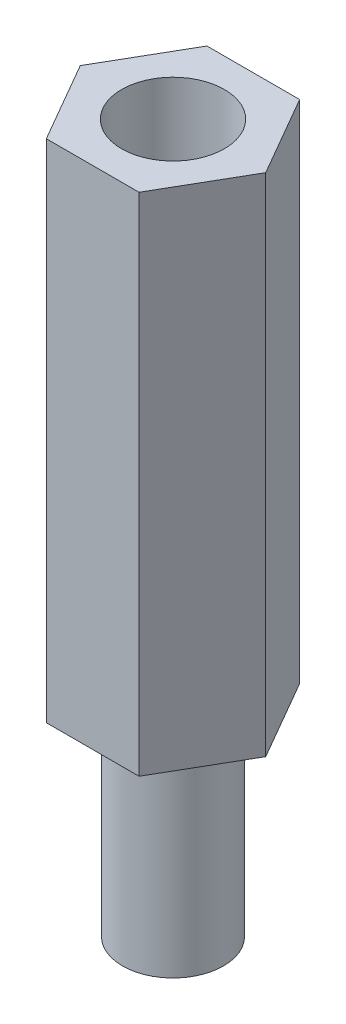
ISO-10303-21;
HEADER;
FILE_DESCRIPTION(('STEP AP214'),'2;1');
FILE_NAME('part.step','',(''),(''),'','','');
FILE_SCHEMA(('AUTOMOTIVE_DESIGN { 1 0 10303 214 1 1 1 1 }'));
ENDSEC;
DATA;
#1=APPLICATION_CONTEXT('core data for automotive mechanical design processes');
#2=APPLICATION_PROTOCOL_DEFINITION('international standard','automotive_design',2000,#1);
#3=PRODUCT_CONTEXT('',#1,'mechanical');
#4=PRODUCT('Part','Part','',(#3));
#5=PRODUCT_RELATED_PRODUCT_CATEGORY('part','',(#4));
#6=PRODUCT_DEFINITION_FORMATION('','',#4);
#7=PRODUCT_DEFINITION_CONTEXT('part definition',#1,'design');
#8=PRODUCT_DEFINITION('design','',#6,#7);
#9=PRODUCT_DEFINITION_SHAPE('','',#8);
#10=(LENGTH_UNIT() NAMED_UNIT(*) SI_UNIT(.MILLI.,.METRE.));
#11=(NAMED_UNIT(*) PLANE_ANGLE_UNIT() SI_UNIT($,.RADIAN.));
#12=(NAMED_UNIT(*) SI_UNIT($,.STERADIAN.) SOLID_ANGLE_UNIT());
#13=UNCERTAINTY_MEASURE_WITH_UNIT(LENGTH_MEASURE(1.E-05),#10,'distance_accuracy_value','');
#14=(GEOMETRIC_REPRESENTATION_CONTEXT(3) GLOBAL_UNCERTAINTY_ASSIGNED_CONTEXT((#13)) GLOBAL_UNIT_ASSIGNED_CONTEXT((#10,
#11,#12)) REPRESENTATION_CONTEXT('',''));
#15=CARTESIAN_POINT('',(0.,0.,0.));
#16=DIRECTION('',(0.,0.,1.));
#17=DIRECTION('',(1.,0.,0.));
#18=AXIS2_PLACEMENT_3D('',#15,#16,#17);
#19=CARTESIAN_POINT('',(0.,6.,0.));
#20=DIRECTION('',(0.,-1.,0.));
#21=DIRECTION('',(0.,0.,-1.));
#22=AXIS2_PLACEMENT_3D('',#19,#20,#21);
#23=CYLINDRICAL_SURFACE('',#22,1.5);
#24=CARTESIAN_POINT('',(0.,6.,0.));
#25=DIRECTION('',(0.,1.,0.));
#26=DIRECTION('',(0.,0.,1.));
#27=AXIS2_PLACEMENT_3D('',#24,#25,#26);
#28=CIRCLE('',#27,1.5);
#29=CARTESIAN_POINT('',(0.,6.,1.5));
#30=VERTEX_POINT('',#29);
#31=EDGE_CURVE('E11',#30,#30,#28,.T.);
#32=ORIENTED_EDGE('',*,*,#31,.F.);
#33=EDGE_LOOP('',(#32));
#34=FACE_BOUND('',#33,.T.);
#35=CARTESIAN_POINT('',(0.,0.,0.));
#36=DIRECTION('',(0.,1.,0.));
#37=DIRECTION('',(0.,0.,1.));
#38=AXIS2_PLACEMENT_3D('',#35,#36,#37);
#39=CIRCLE('',#38,1.5);
#40=CARTESIAN_POINT('',(0.,0.,1.5));
#41=VERTEX_POINT('',#40);
#42=EDGE_CURVE('E42',#41,#41,#39,.T.);
#43=ORIENTED_EDGE('',*,*,#42,.T.);
#44=EDGE_LOOP('',(#43));
#45=FACE_BOUND('',#44,.T.);
#46=ADVANCED_FACE('F39',(#34,#45),#23,.T.);
#47=CARTESIAN_POINT('',(0.,0.,0.));
#48=DIRECTION('',(0.,1.,0.));
#49=DIRECTION('',(0.,0.,1.));
#50=AXIS2_PLACEMENT_3D('',#47,#48,#49);
#51=PLANE('',#50);
#52=ORIENTED_EDGE('',*,*,#42,.F.);
#53=EDGE_LOOP('',(#52));
#54=FACE_BOUND('',#53,.T.);
#55=ADVANCED_FACE('F167',(#54),#51,.F.);
#56=CARTESIAN_POINT('',(1.375,21.,2.38156986040721));
#57=DIRECTION('',(-0.866025403784439,0.,-0.5));
#58=DIRECTION('',(-0.5,0.,0.866025403784439));
#59=AXIS2_PLACEMENT_3D('',#56,#57,#58);
#60=PLANE('',#59);
#61=DIRECTION('',(0.5,0.,-0.866025403784439));
#62=VECTOR('',#61,1.);
#63=CARTESIAN_POINT('',(1.375,6.,2.38156986040721));
#64=LINE('',#63,#62);
#65=CARTESIAN_POINT('',(1.375,6.,2.38156986040721));
#66=VERTEX_POINT('',#65);
#67=CARTESIAN_POINT('',(2.75,6.,0.));
#68=VERTEX_POINT('',#67);
#69=EDGE_CURVE('E131',#66,#68,#64,.T.);
#70=ORIENTED_EDGE('',*,*,#69,.T.);
#71=DIRECTION('',(0.,-1.,0.));
#72=VECTOR('',#71,1.);
#73=CARTESIAN_POINT('',(2.75,21.,0.));
#74=LINE('',#73,#72);
#75=CARTESIAN_POINT('',(2.75,21.,0.));
#76=VERTEX_POINT('',#75);
#77=EDGE_CURVE('E159',#76,#68,#74,.T.);
#78=ORIENTED_EDGE('',*,*,#77,.F.);
#79=DIRECTION('',(0.5,0.,-0.866025403784439));
#80=VECTOR('',#79,1.);
#81=CARTESIAN_POINT('',(1.375,21.,2.38156986040721));
#82=LINE('',#81,#80);
#83=CARTESIAN_POINT('',(1.375,21.,2.38156986040721));
#84=VERTEX_POINT('',#83);
#85=EDGE_CURVE('E148',#84,#76,#82,.T.);
#86=ORIENTED_EDGE('',*,*,#85,.F.);
#87=DIRECTION('',(0.,-1.,0.));
#88=VECTOR('',#87,1.);
#89=CARTESIAN_POINT('',(1.375,21.,2.38156986040721));
#90=LINE('',#89,#88);
#91=EDGE_CURVE('E127',#84,#66,#90,.T.);
#92=ORIENTED_EDGE('',*,*,#91,.T.);
#93=EDGE_LOOP('',(#70,#78,#86,#92));
#94=FACE_BOUND('',#93,.T.);
#95=ADVANCED_FACE('F169',(#94),#60,.F.);
#96=CARTESIAN_POINT('',(2.75,21.,0.));
#97=DIRECTION('',(-0.866025403784438,0.,0.500000000000001));
#98=DIRECTION('',(0.500000000000001,0.,0.866025403784438));
#99=AXIS2_PLACEMENT_3D('',#96,#97,#98);
#100=PLANE('',#99);
#101=DIRECTION('',(-0.500000000000001,0.,-0.866025403784438));
#102=VECTOR('',#101,1.);
#103=CARTESIAN_POINT('',(2.75,6.,0.));
#104=LINE('',#103,#102);
#105=CARTESIAN_POINT('',(1.375,6.,-2.38156986040721));
#106=VERTEX_POINT('',#105);
#107=EDGE_CURVE('E135',#68,#106,#104,.T.);
#108=ORIENTED_EDGE('',*,*,#107,.T.);
#109=DIRECTION('',(0.,-1.,0.));
#110=VECTOR('',#109,1.);
#111=CARTESIAN_POINT('',(1.375,21.,-2.38156986040721));
#112=LINE('',#111,#110);
#113=CARTESIAN_POINT('',(1.375,21.,-2.38156986040721));
#114=VERTEX_POINT('',#113);
#115=EDGE_CURVE('E155',#114,#106,#112,.T.);
#116=ORIENTED_EDGE('',*,*,#115,.F.);
#117=DIRECTION('',(-0.500000000000001,0.,-0.866025403784438));
#118=VECTOR('',#117,1.);
#119=CARTESIAN_POINT('',(2.75,21.,0.));
#120=LINE('',#119,#118);
#121=EDGE_CURVE('E95',#76,#114,#120,.T.);
#122=ORIENTED_EDGE('',*,*,#121,.F.);
#123=ORIENTED_EDGE('',*,*,#77,.T.);
#124=EDGE_LOOP('',(#108,#116,#122,#123));
#125=FACE_BOUND('',#124,.T.);
#126=ADVANCED_FACE('F174',(#125),#100,.F.);
#127=CARTESIAN_POINT('',(1.375,21.,-2.38156986040721));
#128=DIRECTION('',(0.,0.,1.));
#129=DIRECTION('',(1.,0.,0.));
#130=AXIS2_PLACEMENT_3D('',#127,#128,#129);
#131=PLANE('',#130);
#132=DIRECTION('',(-1.,0.,0.));
#133=VECTOR('',#132,1.);
#134=CARTESIAN_POINT('',(1.375,6.,-2.38156986040721));
#135=LINE('',#134,#133);
#136=CARTESIAN_POINT('',(-1.375,6.,-2.38156986040721));
#137=VERTEX_POINT('',#136);
#138=EDGE_CURVE('E139',#106,#137,#135,.T.);
#139=ORIENTED_EDGE('',*,*,#138,.T.);
#140=DIRECTION('',(0.,-1.,0.));
#141=VECTOR('',#140,1.);
#142=CARTESIAN_POINT('',(-1.375,21.,-2.38156986040721));
#143=LINE('',#142,#141);
#144=CARTESIAN_POINT('',(-1.375,21.,-2.38156986040721));
#145=VERTEX_POINT('',#144);
#146=EDGE_CURVE('E120',#145,#137,#143,.T.);
#147=ORIENTED_EDGE('',*,*,#146,.F.);
#148=DIRECTION('',(-1.,0.,0.));
#149=VECTOR('',#148,1.);
#150=CARTESIAN_POINT('',(1.375,21.,-2.38156986040721));
#151=LINE('',#150,#149);
#152=EDGE_CURVE('E109',#114,#145,#151,.T.);
#153=ORIENTED_EDGE('',*,*,#152,.F.);
#154=ORIENTED_EDGE('',*,*,#115,.T.);
#155=EDGE_LOOP('',(#139,#147,#153,#154));
#156=FACE_BOUND('',#155,.T.);
#157=ADVANCED_FACE('F181',(#156),#131,.F.);
#158=CARTESIAN_POINT('',(-1.375,21.,-2.38156986040721));
#159=DIRECTION('',(0.866025403784439,0.,0.5));
#160=DIRECTION('',(0.5,0.,-0.866025403784439));
#161=AXIS2_PLACEMENT_3D('',#158,#159,#160);
#162=PLANE('',#161);
#163=DIRECTION('',(-0.5,0.,0.866025403784439));
#164=VECTOR('',#163,1.);
#165=CARTESIAN_POINT('',(-1.375,6.,-2.38156986040721));
#166=LINE('',#165,#164);
#167=CARTESIAN_POINT('',(-2.75,6.,0.));
#168=VERTEX_POINT('',#167);
#169=EDGE_CURVE('E118',#137,#168,#166,.T.);
#170=ORIENTED_EDGE('',*,*,#169,.T.);
#171=DIRECTION('',(0.,-1.,0.));
#172=VECTOR('',#171,1.);
#173=CARTESIAN_POINT('',(-2.75,21.,0.));
#174=LINE('',#173,#172);
#175=CARTESIAN_POINT('',(-2.75,21.,0.));
#176=VERTEX_POINT('',#175);
#177=EDGE_CURVE('E115',#176,#168,#174,.T.);
#178=ORIENTED_EDGE('',*,*,#177,.F.);
#179=DIRECTION('',(-0.5,0.,0.866025403784439));
#180=VECTOR('',#179,1.);
#181=CARTESIAN_POINT('',(-1.375,21.,-2.38156986040721));
#182=LINE('',#181,#180);
#183=EDGE_CURVE('E103',#145,#176,#182,.T.);
#184=ORIENTED_EDGE('',*,*,#183,.F.);
#185=ORIENTED_EDGE('',*,*,#146,.T.);
#186=EDGE_LOOP('',(#170,#178,#184,#185));
#187=FACE_BOUND('',#186,.T.);
#188=ADVANCED_FACE('F116',(#187),#162,.F.);
#189=CARTESIAN_POINT('',(-2.75,21.,0.));
#190=DIRECTION('',(0.866025403784439,0.,-0.5));
#191=DIRECTION('',(-0.5,0.,-0.866025403784439));
#192=AXIS2_PLACEMENT_3D('',#189,#190,#191);
#193=PLANE('',#192);
#194=DIRECTION('',(0.5,0.,0.866025403784439));
#195=VECTOR('',#194,1.);
#196=CARTESIAN_POINT('',(-2.75,6.,0.));
#197=LINE('',#196,#195);
#198=CARTESIAN_POINT('',(-1.375,6.,2.38156986040721));
#199=VERTEX_POINT('',#198);
#200=EDGE_CURVE('E80',#168,#199,#197,.T.);
#201=ORIENTED_EDGE('',*,*,#200,.T.);
#202=DIRECTION('',(0.,-1.,0.));
#203=VECTOR('',#202,1.);
#204=CARTESIAN_POINT('',(-1.375,21.,2.38156986040721));
#205=LINE('',#204,#203);
#206=CARTESIAN_POINT('',(-1.375,21.,2.38156986040721));
#207=VERTEX_POINT('',#206);
#208=EDGE_CURVE('E121',#207,#199,#205,.T.);
#209=ORIENTED_EDGE('',*,*,#208,.F.);
#210=DIRECTION('',(0.5,0.,0.866025403784439));
#211=VECTOR('',#210,1.);
#212=CARTESIAN_POINT('',(-2.75,21.,0.));
#213=LINE('',#212,#211);
#214=EDGE_CURVE('E107',#176,#207,#213,.T.);
#215=ORIENTED_EDGE('',*,*,#214,.F.);
#216=ORIENTED_EDGE('',*,*,#177,.T.);
#217=EDGE_LOOP('',(#201,#209,#215,#216));
#218=FACE_BOUND('',#217,.T.);
#219=ADVANCED_FACE('F123',(#218),#193,.F.);
#220=CARTESIAN_POINT('',(-1.375,21.,2.38156986040721));
#221=DIRECTION('',(0.,0.,-1.));
#222=DIRECTION('',(-1.,0.,0.));
#223=AXIS2_PLACEMENT_3D('',#220,#221,#222);
#224=PLANE('',#223);
#225=DIRECTION('',(1.,0.,0.));
#226=VECTOR('',#225,1.);
#227=CARTESIAN_POINT('',(-1.375,6.,2.38156986040721));
#228=LINE('',#227,#226);
#229=EDGE_CURVE('E86',#199,#66,#228,.T.);
#230=ORIENTED_EDGE('',*,*,#229,.T.);
#231=ORIENTED_EDGE('',*,*,#91,.F.);
#232=DIRECTION('',(1.,0.,0.));
#233=VECTOR('',#232,1.);
#234=CARTESIAN_POINT('',(-1.375,21.,2.38156986040721));
#235=LINE('',#234,#233);
#236=EDGE_CURVE('E56',#207,#84,#235,.T.);
#237=ORIENTED_EDGE('',*,*,#236,.F.);
#238=ORIENTED_EDGE('',*,*,#208,.T.);
#239=EDGE_LOOP('',(#230,#231,#237,#238));
#240=FACE_BOUND('',#239,.T.);
#241=ADVANCED_FACE('F189',(#240),#224,.F.);
#242=CARTESIAN_POINT('',(0.,21.,0.));
#243=DIRECTION('',(0.,1.,0.));
#244=DIRECTION('',(0.,0.,1.));
#245=AXIS2_PLACEMENT_3D('',#242,#243,#244);
#246=PLANE('',#245);
#247=CARTESIAN_POINT('',(0.,21.,0.));
#248=DIRECTION('',(0.,1.,0.));
#249=DIRECTION('',(0.,0.,1.));
#250=AXIS2_PLACEMENT_3D('',#247,#248,#249);
#251=CIRCLE('',#250,1.52399999999999);
#252=CARTESIAN_POINT('',(0.,21.,1.52399999999999));
#253=VERTEX_POINT('',#252);
#254=EDGE_CURVE('E213',#253,#253,#251,.T.);
#255=ORIENTED_EDGE('',*,*,#254,.F.);
#256=EDGE_LOOP('',(#255));
#257=FACE_BOUND('',#256,.T.);
#258=ORIENTED_EDGE('',*,*,#85,.T.);
#259=ORIENTED_EDGE('',*,*,#121,.T.);
#260=ORIENTED_EDGE('',*,*,#152,.T.);
#261=ORIENTED_EDGE('',*,*,#183,.T.);
#262=ORIENTED_EDGE('',*,*,#214,.T.);
#263=ORIENTED_EDGE('',*,*,#236,.T.);
#264=EDGE_LOOP('',(#258,#259,#260,#261,#262,#263));
#265=FACE_BOUND('',#264,.T.);
#266=ADVANCED_FACE('F105',(#257,#265),#246,.T.);
#267=CARTESIAN_POINT('',(0.,6.,0.));
#268=DIRECTION('',(0.,1.,0.));
#269=DIRECTION('',(0.,0.,1.));
#270=AXIS2_PLACEMENT_3D('',#267,#268,#269);
#271=PLANE('',#270);
#272=ORIENTED_EDGE('',*,*,#31,.T.);
#273=EDGE_LOOP('',(#272));
#274=FACE_BOUND('',#273,.T.);
#275=ORIENTED_EDGE('',*,*,#69,.F.);
#276=ORIENTED_EDGE('',*,*,#229,.F.);
#277=ORIENTED_EDGE('',*,*,#200,.F.);
#278=ORIENTED_EDGE('',*,*,#169,.F.);
#279=ORIENTED_EDGE('',*,*,#138,.F.);
#280=ORIENTED_EDGE('',*,*,#107,.F.);
#281=EDGE_LOOP('',(#275,#276,#277,#278,#279,#280));
#282=FACE_BOUND('',#281,.T.);
#283=ADVANCED_FACE('F192',(#274,#282),#271,.F.);
#284=CARTESIAN_POINT('',(0.,15.,0.));
#285=DIRECTION('',(0.,1.,0.));
#286=DIRECTION('',(0.,0.,1.));
#287=AXIS2_PLACEMENT_3D('',#284,#285,#286);
#288=CONICAL_SURFACE('',#287,1.524,1.02974425867665);
#289=CARTESIAN_POINT('',(0.,14.084288416602,0.));
#290=VERTEX_POINT('',#289);
#291=VERTEX_LOOP('',#290);
#292=FACE_BOUND('',#291,.T.);
#293=CARTESIAN_POINT('',(0.,15.,0.));
#294=DIRECTION('',(0.,1.,0.));
#295=DIRECTION('',(0.,0.,1.));
#296=AXIS2_PLACEMENT_3D('',#293,#294,#295);
#297=CIRCLE('',#296,1.524);
#298=CARTESIAN_POINT('',(0.,15.,1.524));
#299=VERTEX_POINT('',#298);
#300=EDGE_CURVE('E136',#299,#299,#297,.T.);
#301=ORIENTED_EDGE('',*,*,#300,.T.);
#302=EDGE_LOOP('',(#301));
#303=FACE_BOUND('',#302,.T.);
#304=ADVANCED_FACE('F195',(#292,#303),#288,.F.);
#305=CARTESIAN_POINT('',(0.,21.,0.));
#306=DIRECTION('',(0.,1.,0.));
#307=DIRECTION('',(0.,0.,1.));
#308=AXIS2_PLACEMENT_3D('',#305,#306,#307);
#309=CYLINDRICAL_SURFACE('',#308,1.52399999999999);
#310=ORIENTED_EDGE('',*,*,#300,.F.);
#311=EDGE_LOOP('',(#310));
#312=FACE_BOUND('',#311,.T.);
#313=ORIENTED_EDGE('',*,*,#254,.T.);
#314=EDGE_LOOP('',(#313));
#315=FACE_BOUND('',#314,.T.);
#316=ADVANCED_FACE('F202',(#312,#315),#309,.F.);
#317=CLOSED_SHELL('',(#46,#55,#95,#126,#157,#188,#219,#241,#266,#283,#304,#316));
#318=MANIFOLD_SOLID_BREP('B2',#317);
#319=ADVANCED_BREP_SHAPE_REPRESENTATION('',(#18,#318),#14);
#320=SHAPE_DEFINITION_REPRESENTATION(#9,#319);
ENDSEC;
END-ISO-10303-21;
